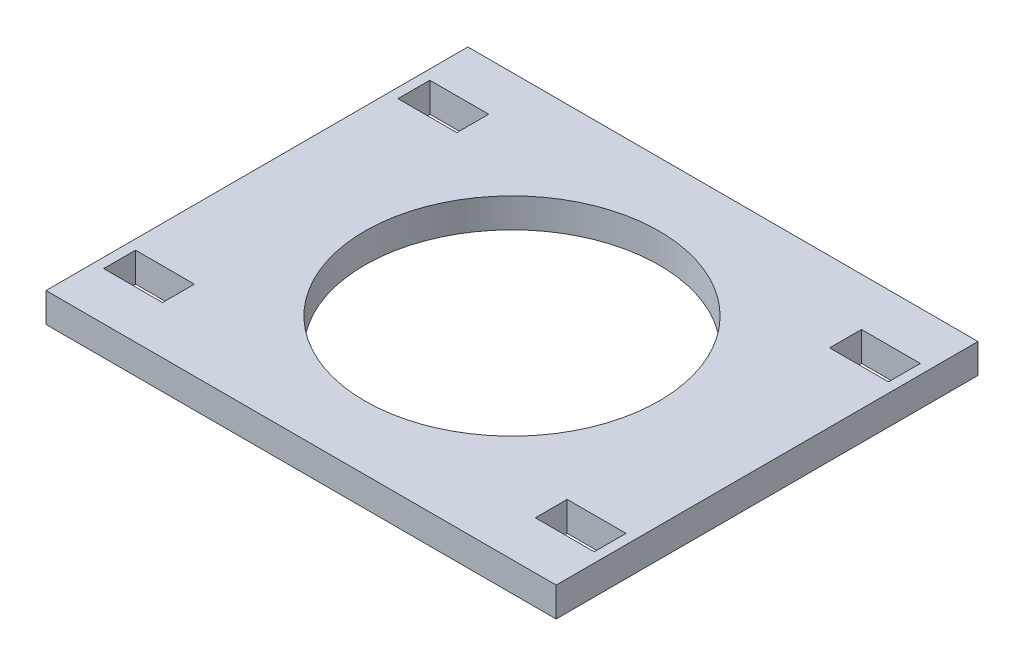
ISO-10303-21;
HEADER;
FILE_DESCRIPTION(('STEP AP214'),'2;1');
FILE_NAME('part.step','',(''),(''),'','','');
FILE_SCHEMA(('AUTOMOTIVE_DESIGN { 1 0 10303 214 1 1 1 1 }'));
ENDSEC;
DATA;
#1=APPLICATION_CONTEXT('core data for automotive mechanical design processes');
#2=APPLICATION_PROTOCOL_DEFINITION('international standard','automotive_design',2000,#1);
#3=PRODUCT_CONTEXT('',#1,'mechanical');
#4=PRODUCT('Part','Part','',(#3));
#5=PRODUCT_RELATED_PRODUCT_CATEGORY('part','',(#4));
#6=PRODUCT_DEFINITION_FORMATION('','',#4);
#7=PRODUCT_DEFINITION_CONTEXT('part definition',#1,'design');
#8=PRODUCT_DEFINITION('design','',#6,#7);
#9=PRODUCT_DEFINITION_SHAPE('','',#8);
#10=(LENGTH_UNIT() NAMED_UNIT(*) SI_UNIT(.MILLI.,.METRE.));
#11=(NAMED_UNIT(*) PLANE_ANGLE_UNIT() SI_UNIT($,.RADIAN.));
#12=(NAMED_UNIT(*) SI_UNIT($,.STERADIAN.) SOLID_ANGLE_UNIT());
#13=UNCERTAINTY_MEASURE_WITH_UNIT(LENGTH_MEASURE(1.E-05),#10,'distance_accuracy_value','');
#14=(GEOMETRIC_REPRESENTATION_CONTEXT(3) GLOBAL_UNCERTAINTY_ASSIGNED_CONTEXT((#13)) GLOBAL_UNIT_ASSIGNED_CONTEXT((#10,
#11,#12)) REPRESENTATION_CONTEXT('',''));
#15=CARTESIAN_POINT('',(0.,0.,0.));
#16=DIRECTION('',(0.,0.,1.));
#17=DIRECTION('',(1.,0.,0.));
#18=AXIS2_PLACEMENT_3D('',#15,#16,#17);
#19=CARTESIAN_POINT('',(0.,6.,0.));
#20=DIRECTION('',(0.,-1.,0.));
#21=DIRECTION('',(0.,0.,-1.));
#22=AXIS2_PLACEMENT_3D('',#19,#20,#21);
#23=PLANE('',#22);
#24=DIRECTION('',(0.,0.,1.));
#25=VECTOR('',#24,1.);
#26=CARTESIAN_POINT('',(38.,6.,33.25));
#27=LINE('',#26,#25);
#28=CARTESIAN_POINT('',(38.,6.,26.75));
#29=VERTEX_POINT('',#28);
#30=CARTESIAN_POINT('',(38.,6.,33.25));
#31=VERTEX_POINT('',#30);
#32=EDGE_CURVE('E214',#29,#31,#27,.T.);
#33=ORIENTED_EDGE('',*,*,#32,.F.);
#34=DIRECTION('',(-1.,0.,0.));
#35=VECTOR('',#34,1.);
#36=CARTESIAN_POINT('',(38.,6.,26.75));
#37=LINE('',#36,#35);
#38=CARTESIAN_POINT('',(50.,6.,26.75));
#39=VERTEX_POINT('',#38);
#40=EDGE_CURVE('E223',#39,#29,#37,.T.);
#41=ORIENTED_EDGE('',*,*,#40,.F.);
#42=DIRECTION('',(0.,0.,-1.));
#43=VECTOR('',#42,1.);
#44=CARTESIAN_POINT('',(50.,6.,33.25));
#45=LINE('',#44,#43);
#46=CARTESIAN_POINT('',(50.,6.,33.25));
#47=VERTEX_POINT('',#46);
#48=EDGE_CURVE('E217',#47,#39,#45,.T.);
#49=ORIENTED_EDGE('',*,*,#48,.F.);
#50=DIRECTION('',(1.,0.,0.));
#51=VECTOR('',#50,1.);
#52=CARTESIAN_POINT('',(38.,6.,33.25));
#53=LINE('',#52,#51);
#54=EDGE_CURVE('E220',#31,#47,#53,.T.);
#55=ORIENTED_EDGE('',*,*,#54,.F.);
#56=EDGE_LOOP('',(#33,#41,#49,#55));
#57=FACE_BOUND('',#56,.T.);
#58=DIRECTION('',(0.,0.,1.));
#59=VECTOR('',#58,1.);
#60=CARTESIAN_POINT('',(-50.,6.,33.25));
#61=LINE('',#60,#59);
#62=CARTESIAN_POINT('',(-50.,6.,26.75));
#63=VERTEX_POINT('',#62);
#64=CARTESIAN_POINT('',(-50.,6.,33.25));
#65=VERTEX_POINT('',#64);
#66=EDGE_CURVE('E280',#63,#65,#61,.T.);
#67=ORIENTED_EDGE('',*,*,#66,.F.);
#68=DIRECTION('',(-1.,0.,0.));
#69=VECTOR('',#68,1.);
#70=CARTESIAN_POINT('',(-50.,6.,26.75));
#71=LINE('',#70,#69);
#72=CARTESIAN_POINT('',(-38.,6.,26.75));
#73=VERTEX_POINT('',#72);
#74=EDGE_CURVE('E283',#73,#63,#71,.T.);
#75=ORIENTED_EDGE('',*,*,#74,.F.);
#76=DIRECTION('',(0.,0.,-1.));
#77=VECTOR('',#76,1.);
#78=CARTESIAN_POINT('',(-38.,6.,33.25));
#79=LINE('',#78,#77);
#80=CARTESIAN_POINT('',(-38.,6.,33.25));
#81=VERTEX_POINT('',#80);
#82=EDGE_CURVE('E285',#81,#73,#79,.T.);
#83=ORIENTED_EDGE('',*,*,#82,.F.);
#84=DIRECTION('',(1.,0.,0.));
#85=VECTOR('',#84,1.);
#86=CARTESIAN_POINT('',(-50.,6.,33.25));
#87=LINE('',#86,#85);
#88=EDGE_CURVE('E278',#65,#81,#87,.T.);
#89=ORIENTED_EDGE('',*,*,#88,.F.);
#90=EDGE_LOOP('',(#67,#75,#83,#89));
#91=FACE_BOUND('',#90,.T.);
#92=DIRECTION('',(0.,0.,1.));
#93=VECTOR('',#92,1.);
#94=CARTESIAN_POINT('',(-52.,6.,43.));
#95=LINE('',#94,#93);
#96=CARTESIAN_POINT('',(-52.,6.,-43.));
#97=VERTEX_POINT('',#96);
#98=CARTESIAN_POINT('',(-52.,6.,43.));
#99=VERTEX_POINT('',#98);
#100=EDGE_CURVE('E306',#97,#99,#95,.T.);
#101=ORIENTED_EDGE('',*,*,#100,.T.);
#102=DIRECTION('',(1.,0.,0.));
#103=VECTOR('',#102,1.);
#104=CARTESIAN_POINT('',(-52.,6.,43.));
#105=LINE('',#104,#103);
#106=CARTESIAN_POINT('',(52.,6.,43.));
#107=VERTEX_POINT('',#106);
#108=EDGE_CURVE('E311',#99,#107,#105,.T.);
#109=ORIENTED_EDGE('',*,*,#108,.T.);
#110=DIRECTION('',(0.,0.,-1.));
#111=VECTOR('',#110,1.);
#112=CARTESIAN_POINT('',(52.,6.,43.));
#113=LINE('',#112,#111);
#114=CARTESIAN_POINT('',(52.,6.,-43.));
#115=VERTEX_POINT('',#114);
#116=EDGE_CURVE('E312',#107,#115,#113,.T.);
#117=ORIENTED_EDGE('',*,*,#116,.T.);
#118=DIRECTION('',(-1.,0.,0.));
#119=VECTOR('',#118,1.);
#120=CARTESIAN_POINT('',(-52.,6.,-43.));
#121=LINE('',#120,#119);
#122=EDGE_CURVE('E316',#115,#97,#121,.T.);
#123=ORIENTED_EDGE('',*,*,#122,.T.);
#124=EDGE_LOOP('',(#101,#109,#117,#123));
#125=FACE_BOUND('',#124,.T.);
#126=DIRECTION('',(0.,0.,1.));
#127=VECTOR('',#126,1.);
#128=CARTESIAN_POINT('',(-50.,6.,-26.75));
#129=LINE('',#128,#127);
#130=CARTESIAN_POINT('',(-50.,6.,-33.25));
#131=VERTEX_POINT('',#130);
#132=CARTESIAN_POINT('',(-50.,6.,-26.75));
#133=VERTEX_POINT('',#132);
#134=EDGE_CURVE('E247',#131,#133,#129,.T.);
#135=ORIENTED_EDGE('',*,*,#134,.F.);
#136=DIRECTION('',(-1.,0.,0.));
#137=VECTOR('',#136,1.);
#138=CARTESIAN_POINT('',(-50.,6.,-33.25));
#139=LINE('',#138,#137);
#140=CARTESIAN_POINT('',(-38.,6.,-33.25));
#141=VERTEX_POINT('',#140);
#142=EDGE_CURVE('E253',#141,#131,#139,.T.);
#143=ORIENTED_EDGE('',*,*,#142,.F.);
#144=DIRECTION('',(0.,0.,-1.));
#145=VECTOR('',#144,1.);
#146=CARTESIAN_POINT('',(-38.,6.,-26.75));
#147=LINE('',#146,#145);
#148=CARTESIAN_POINT('',(-38.,6.,-26.75));
#149=VERTEX_POINT('',#148);
#150=EDGE_CURVE('E251',#149,#141,#147,.T.);
#151=ORIENTED_EDGE('',*,*,#150,.F.);
#152=DIRECTION('',(1.,0.,0.));
#153=VECTOR('',#152,1.);
#154=CARTESIAN_POINT('',(-50.,6.,-26.75));
#155=LINE('',#154,#153);
#156=EDGE_CURVE('E246',#133,#149,#155,.T.);
#157=ORIENTED_EDGE('',*,*,#156,.F.);
#158=EDGE_LOOP('',(#135,#143,#151,#157));
#159=FACE_BOUND('',#158,.T.);
#160=DIRECTION('',(0.,0.,1.));
#161=VECTOR('',#160,1.);
#162=CARTESIAN_POINT('',(38.,6.,-26.75));
#163=LINE('',#162,#161);
#164=CARTESIAN_POINT('',(38.,6.,-33.25));
#165=VERTEX_POINT('',#164);
#166=CARTESIAN_POINT('',(38.,6.,-26.75));
#167=VERTEX_POINT('',#166);
#168=EDGE_CURVE('E176',#165,#167,#163,.T.);
#169=ORIENTED_EDGE('',*,*,#168,.F.);
#170=DIRECTION('',(-1.,0.,0.));
#171=VECTOR('',#170,1.);
#172=CARTESIAN_POINT('',(38.,6.,-33.25));
#173=LINE('',#172,#171);
#174=CARTESIAN_POINT('',(50.,6.,-33.25));
#175=VERTEX_POINT('',#174);
#176=EDGE_CURVE('E198',#175,#165,#173,.T.);
#177=ORIENTED_EDGE('',*,*,#176,.F.);
#178=DIRECTION('',(0.,0.,-1.));
#179=VECTOR('',#178,1.);
#180=CARTESIAN_POINT('',(50.,6.,-26.75));
#181=LINE('',#180,#179);
#182=CARTESIAN_POINT('',(50.,6.,-26.75));
#183=VERTEX_POINT('',#182);
#184=EDGE_CURVE('E197',#183,#175,#181,.T.);
#185=ORIENTED_EDGE('',*,*,#184,.F.);
#186=DIRECTION('',(1.,0.,0.));
#187=VECTOR('',#186,1.);
#188=CARTESIAN_POINT('',(38.,6.,-26.75));
#189=LINE('',#188,#187);
#190=EDGE_CURVE('E182',#167,#183,#189,.T.);
#191=ORIENTED_EDGE('',*,*,#190,.F.);
#192=EDGE_LOOP('',(#169,#177,#185,#191));
#193=FACE_BOUND('',#192,.T.);
#194=CARTESIAN_POINT('',(0.,6.,0.));
#195=DIRECTION('',(0.,1.,0.));
#196=DIRECTION('',(0.,0.,1.));
#197=AXIS2_PLACEMENT_3D('',#194,#195,#196);
#198=CIRCLE('',#197,30.);
#199=CARTESIAN_POINT('',(0.,6.,30.));
#200=VERTEX_POINT('',#199);
#201=EDGE_CURVE('E203',#200,#200,#198,.T.);
#202=ORIENTED_EDGE('',*,*,#201,.F.);
#203=EDGE_LOOP('',(#202));
#204=FACE_BOUND('',#203,.T.);
#205=ADVANCED_FACE('F39',(#57,#91,#125,#159,#193,#204),#23,.F.);
#206=CARTESIAN_POINT('',(0.,0.,0.));
#207=DIRECTION('',(0.,-1.,0.));
#208=DIRECTION('',(0.,0.,-1.));
#209=AXIS2_PLACEMENT_3D('',#206,#207,#208);
#210=PLANE('',#209);
#211=DIRECTION('',(-1.,0.,0.));
#212=VECTOR('',#211,1.);
#213=CARTESIAN_POINT('',(38.,0.,-33.25));
#214=LINE('',#213,#212);
#215=CARTESIAN_POINT('',(50.,0.,-33.25));
#216=VERTEX_POINT('',#215);
#217=CARTESIAN_POINT('',(38.,0.,-33.25));
#218=VERTEX_POINT('',#217);
#219=EDGE_CURVE('E184',#216,#218,#214,.T.);
#220=ORIENTED_EDGE('',*,*,#219,.T.);
#221=DIRECTION('',(0.,0.,1.));
#222=VECTOR('',#221,1.);
#223=CARTESIAN_POINT('',(38.,0.,-26.75));
#224=LINE('',#223,#222);
#225=CARTESIAN_POINT('',(38.,0.,-26.75));
#226=VERTEX_POINT('',#225);
#227=EDGE_CURVE('E62',#218,#226,#224,.T.);
#228=ORIENTED_EDGE('',*,*,#227,.T.);
#229=DIRECTION('',(1.,0.,0.));
#230=VECTOR('',#229,1.);
#231=CARTESIAN_POINT('',(38.,0.,-26.75));
#232=LINE('',#231,#230);
#233=CARTESIAN_POINT('',(50.,0.,-26.75));
#234=VERTEX_POINT('',#233);
#235=EDGE_CURVE('E192',#226,#234,#232,.T.);
#236=ORIENTED_EDGE('',*,*,#235,.T.);
#237=DIRECTION('',(0.,0.,-1.));
#238=VECTOR('',#237,1.);
#239=CARTESIAN_POINT('',(50.,0.,-26.75));
#240=LINE('',#239,#238);
#241=EDGE_CURVE('E207',#234,#216,#240,.T.);
#242=ORIENTED_EDGE('',*,*,#241,.T.);
#243=EDGE_LOOP('',(#220,#228,#236,#242));
#244=FACE_BOUND('',#243,.T.);
#245=DIRECTION('',(-1.,0.,0.));
#246=VECTOR('',#245,1.);
#247=CARTESIAN_POINT('',(38.,0.,26.75));
#248=LINE('',#247,#246);
#249=CARTESIAN_POINT('',(50.,0.,26.75));
#250=VERTEX_POINT('',#249);
#251=CARTESIAN_POINT('',(38.,0.,26.75));
#252=VERTEX_POINT('',#251);
#253=EDGE_CURVE('E216',#250,#252,#248,.T.);
#254=ORIENTED_EDGE('',*,*,#253,.T.);
#255=DIRECTION('',(0.,0.,1.));
#256=VECTOR('',#255,1.);
#257=CARTESIAN_POINT('',(38.,0.,33.25));
#258=LINE('',#257,#256);
#259=CARTESIAN_POINT('',(38.,0.,33.25));
#260=VERTEX_POINT('',#259);
#261=EDGE_CURVE('E195',#252,#260,#258,.T.);
#262=ORIENTED_EDGE('',*,*,#261,.T.);
#263=DIRECTION('',(1.,0.,0.));
#264=VECTOR('',#263,1.);
#265=CARTESIAN_POINT('',(38.,0.,33.25));
#266=LINE('',#265,#264);
#267=CARTESIAN_POINT('',(50.,0.,33.25));
#268=VERTEX_POINT('',#267);
#269=EDGE_CURVE('E228',#260,#268,#266,.T.);
#270=ORIENTED_EDGE('',*,*,#269,.T.);
#271=DIRECTION('',(0.,0.,-1.));
#272=VECTOR('',#271,1.);
#273=CARTESIAN_POINT('',(50.,0.,33.25));
#274=LINE('',#273,#272);
#275=EDGE_CURVE('E231',#268,#250,#274,.T.);
#276=ORIENTED_EDGE('',*,*,#275,.T.);
#277=EDGE_LOOP('',(#254,#262,#270,#276));
#278=FACE_BOUND('',#277,.T.);
#279=DIRECTION('',(-1.,0.,0.));
#280=VECTOR('',#279,1.);
#281=CARTESIAN_POINT('',(-50.,0.,-33.25));
#282=LINE('',#281,#280);
#283=CARTESIAN_POINT('',(-38.,0.,-33.25));
#284=VERTEX_POINT('',#283);
#285=CARTESIAN_POINT('',(-50.,0.,-33.25));
#286=VERTEX_POINT('',#285);
#287=EDGE_CURVE('E249',#284,#286,#282,.T.);
#288=ORIENTED_EDGE('',*,*,#287,.T.);
#289=DIRECTION('',(0.,0.,1.));
#290=VECTOR('',#289,1.);
#291=CARTESIAN_POINT('',(-50.,0.,-26.75));
#292=LINE('',#291,#290);
#293=CARTESIAN_POINT('',(-50.,0.,-26.75));
#294=VERTEX_POINT('',#293);
#295=EDGE_CURVE('E245',#286,#294,#292,.T.);
#296=ORIENTED_EDGE('',*,*,#295,.T.);
#297=DIRECTION('',(1.,0.,0.));
#298=VECTOR('',#297,1.);
#299=CARTESIAN_POINT('',(-50.,0.,-26.75));
#300=LINE('',#299,#298);
#301=CARTESIAN_POINT('',(-38.,0.,-26.75));
#302=VERTEX_POINT('',#301);
#303=EDGE_CURVE('E260',#294,#302,#300,.T.);
#304=ORIENTED_EDGE('',*,*,#303,.T.);
#305=DIRECTION('',(0.,0.,-1.));
#306=VECTOR('',#305,1.);
#307=CARTESIAN_POINT('',(-38.,0.,-26.75));
#308=LINE('',#307,#306);
#309=EDGE_CURVE('E265',#302,#284,#308,.T.);
#310=ORIENTED_EDGE('',*,*,#309,.T.);
#311=EDGE_LOOP('',(#288,#296,#304,#310));
#312=FACE_BOUND('',#311,.T.);
#313=DIRECTION('',(-1.,0.,0.));
#314=VECTOR('',#313,1.);
#315=CARTESIAN_POINT('',(-50.,0.,26.75));
#316=LINE('',#315,#314);
#317=CARTESIAN_POINT('',(-38.,0.,26.75));
#318=VERTEX_POINT('',#317);
#319=CARTESIAN_POINT('',(-50.,0.,26.75));
#320=VERTEX_POINT('',#319);
#321=EDGE_CURVE('E279',#318,#320,#316,.T.);
#322=ORIENTED_EDGE('',*,*,#321,.T.);
#323=DIRECTION('',(0.,0.,1.));
#324=VECTOR('',#323,1.);
#325=CARTESIAN_POINT('',(-50.,0.,33.25));
#326=LINE('',#325,#324);
#327=CARTESIAN_POINT('',(-50.,0.,33.25));
#328=VERTEX_POINT('',#327);
#329=EDGE_CURVE('E276',#320,#328,#326,.T.);
#330=ORIENTED_EDGE('',*,*,#329,.T.);
#331=DIRECTION('',(1.,0.,0.));
#332=VECTOR('',#331,1.);
#333=CARTESIAN_POINT('',(-50.,0.,33.25));
#334=LINE('',#333,#332);
#335=CARTESIAN_POINT('',(-38.,0.,33.25));
#336=VERTEX_POINT('',#335);
#337=EDGE_CURVE('E290',#328,#336,#334,.T.);
#338=ORIENTED_EDGE('',*,*,#337,.T.);
#339=DIRECTION('',(0.,0.,-1.));
#340=VECTOR('',#339,1.);
#341=CARTESIAN_POINT('',(-38.,0.,33.25));
#342=LINE('',#341,#340);
#343=EDGE_CURVE('E291',#336,#318,#342,.T.);
#344=ORIENTED_EDGE('',*,*,#343,.T.);
#345=EDGE_LOOP('',(#322,#330,#338,#344));
#346=FACE_BOUND('',#345,.T.);
#347=DIRECTION('',(0.,0.,1.));
#348=VECTOR('',#347,1.);
#349=CARTESIAN_POINT('',(-52.,0.,43.));
#350=LINE('',#349,#348);
#351=CARTESIAN_POINT('',(-52.,0.,-43.));
#352=VERTEX_POINT('',#351);
#353=CARTESIAN_POINT('',(-52.,0.,43.));
#354=VERTEX_POINT('',#353);
#355=EDGE_CURVE('E310',#352,#354,#350,.T.);
#356=ORIENTED_EDGE('',*,*,#355,.F.);
#357=DIRECTION('',(-1.,0.,0.));
#358=VECTOR('',#357,1.);
#359=CARTESIAN_POINT('',(-52.,0.,-43.));
#360=LINE('',#359,#358);
#361=CARTESIAN_POINT('',(52.,0.,-43.));
#362=VERTEX_POINT('',#361);
#363=EDGE_CURVE('E315',#362,#352,#360,.T.);
#364=ORIENTED_EDGE('',*,*,#363,.F.);
#365=DIRECTION('',(0.,0.,-1.));
#366=VECTOR('',#365,1.);
#367=CARTESIAN_POINT('',(52.,0.,43.));
#368=LINE('',#367,#366);
#369=CARTESIAN_POINT('',(52.,0.,43.));
#370=VERTEX_POINT('',#369);
#371=EDGE_CURVE('E322',#370,#362,#368,.T.);
#372=ORIENTED_EDGE('',*,*,#371,.F.);
#373=DIRECTION('',(1.,0.,0.));
#374=VECTOR('',#373,1.);
#375=CARTESIAN_POINT('',(-52.,0.,43.));
#376=LINE('',#375,#374);
#377=EDGE_CURVE('E321',#354,#370,#376,.T.);
#378=ORIENTED_EDGE('',*,*,#377,.F.);
#379=EDGE_LOOP('',(#356,#364,#372,#378));
#380=FACE_BOUND('',#379,.T.);
#381=CARTESIAN_POINT('',(0.,0.,0.));
#382=DIRECTION('',(0.,1.,0.));
#383=DIRECTION('',(0.,0.,1.));
#384=AXIS2_PLACEMENT_3D('',#381,#382,#383);
#385=CIRCLE('',#384,30.);
#386=CARTESIAN_POINT('',(0.,0.,30.));
#387=VERTEX_POINT('',#386);
#388=EDGE_CURVE('E460',#387,#387,#385,.T.);
#389=ORIENTED_EDGE('',*,*,#388,.T.);
#390=EDGE_LOOP('',(#389));
#391=FACE_BOUND('',#390,.T.);
#392=ADVANCED_FACE('F341',(#244,#278,#312,#346,#380,#391),#210,.T.);
#393=CARTESIAN_POINT('',(-52.,6.,43.));
#394=DIRECTION('',(1.,0.,0.));
#395=DIRECTION('',(0.,0.,-1.));
#396=AXIS2_PLACEMENT_3D('',#393,#394,#395);
#397=PLANE('',#396);
#398=ORIENTED_EDGE('',*,*,#355,.T.);
#399=DIRECTION('',(0.,-1.,0.));
#400=VECTOR('',#399,1.);
#401=CARTESIAN_POINT('',(-52.,6.,43.));
#402=LINE('',#401,#400);
#403=EDGE_CURVE('E11',#99,#354,#402,.T.);
#404=ORIENTED_EDGE('',*,*,#403,.F.);
#405=ORIENTED_EDGE('',*,*,#100,.F.);
#406=DIRECTION('',(0.,-1.,0.));
#407=VECTOR('',#406,1.);
#408=CARTESIAN_POINT('',(-52.,6.,-43.));
#409=LINE('',#408,#407);
#410=EDGE_CURVE('E318',#97,#352,#409,.T.);
#411=ORIENTED_EDGE('',*,*,#410,.T.);
#412=EDGE_LOOP('',(#398,#404,#405,#411));
#413=FACE_BOUND('',#412,.T.);
#414=ADVANCED_FACE('F41',(#413),#397,.F.);
#415=CARTESIAN_POINT('',(-52.,6.,43.));
#416=DIRECTION('',(0.,0.,-1.));
#417=DIRECTION('',(-1.,0.,0.));
#418=AXIS2_PLACEMENT_3D('',#415,#416,#417);
#419=PLANE('',#418);
#420=ORIENTED_EDGE('',*,*,#377,.T.);
#421=DIRECTION('',(0.,-1.,0.));
#422=VECTOR('',#421,1.);
#423=CARTESIAN_POINT('',(52.,6.,43.));
#424=LINE('',#423,#422);
#425=EDGE_CURVE('E50',#107,#370,#424,.T.);
#426=ORIENTED_EDGE('',*,*,#425,.F.);
#427=ORIENTED_EDGE('',*,*,#108,.F.);
#428=ORIENTED_EDGE('',*,*,#403,.T.);
#429=EDGE_LOOP('',(#420,#426,#427,#428));
#430=FACE_BOUND('',#429,.T.);
#431=ADVANCED_FACE('F355',(#430),#419,.F.);
#432=CARTESIAN_POINT('',(52.,6.,43.));
#433=DIRECTION('',(-1.,0.,0.));
#434=DIRECTION('',(0.,0.,1.));
#435=AXIS2_PLACEMENT_3D('',#432,#433,#434);
#436=PLANE('',#435);
#437=ORIENTED_EDGE('',*,*,#371,.T.);
#438=DIRECTION('',(0.,-1.,0.));
#439=VECTOR('',#438,1.);
#440=CARTESIAN_POINT('',(52.,6.,-43.));
#441=LINE('',#440,#439);
#442=EDGE_CURVE('E329',#115,#362,#441,.T.);
#443=ORIENTED_EDGE('',*,*,#442,.F.);
#444=ORIENTED_EDGE('',*,*,#116,.F.);
#445=ORIENTED_EDGE('',*,*,#425,.T.);
#446=EDGE_LOOP('',(#437,#443,#444,#445));
#447=FACE_BOUND('',#446,.T.);
#448=ADVANCED_FACE('F335',(#447),#436,.F.);
#449=CARTESIAN_POINT('',(-52.,6.,-43.));
#450=DIRECTION('',(0.,0.,1.));
#451=DIRECTION('',(1.,0.,0.));
#452=AXIS2_PLACEMENT_3D('',#449,#450,#451);
#453=PLANE('',#452);
#454=ORIENTED_EDGE('',*,*,#363,.T.);
#455=ORIENTED_EDGE('',*,*,#410,.F.);
#456=ORIENTED_EDGE('',*,*,#122,.F.);
#457=ORIENTED_EDGE('',*,*,#442,.T.);
#458=EDGE_LOOP('',(#454,#455,#456,#457));
#459=FACE_BOUND('',#458,.T.);
#460=ADVANCED_FACE('F345',(#459),#453,.F.);
#461=CARTESIAN_POINT('',(-50.,6.,33.25));
#462=DIRECTION('',(1.,0.,0.));
#463=DIRECTION('',(0.,0.,-1.));
#464=AXIS2_PLACEMENT_3D('',#461,#462,#463);
#465=PLANE('',#464);
#466=ORIENTED_EDGE('',*,*,#329,.F.);
#467=DIRECTION('',(0.,-1.,0.));
#468=VECTOR('',#467,1.);
#469=CARTESIAN_POINT('',(-50.,6.,26.75));
#470=LINE('',#469,#468);
#471=EDGE_CURVE('E287',#63,#320,#470,.T.);
#472=ORIENTED_EDGE('',*,*,#471,.F.);
#473=ORIENTED_EDGE('',*,*,#66,.T.);
#474=DIRECTION('',(0.,-1.,0.));
#475=VECTOR('',#474,1.);
#476=CARTESIAN_POINT('',(-50.,6.,33.25));
#477=LINE('',#476,#475);
#478=EDGE_CURVE('E305',#65,#328,#477,.T.);
#479=ORIENTED_EDGE('',*,*,#478,.T.);
#480=EDGE_LOOP('',(#466,#472,#473,#479));
#481=FACE_BOUND('',#480,.T.);
#482=ADVANCED_FACE('F369',(#481),#465,.T.);
#483=CARTESIAN_POINT('',(-50.,6.,33.25));
#484=DIRECTION('',(0.,0.,-1.));
#485=DIRECTION('',(-1.,0.,0.));
#486=AXIS2_PLACEMENT_3D('',#483,#484,#485);
#487=PLANE('',#486);
#488=ORIENTED_EDGE('',*,*,#337,.F.);
#489=ORIENTED_EDGE('',*,*,#478,.F.);
#490=ORIENTED_EDGE('',*,*,#88,.T.);
#491=DIRECTION('',(0.,-1.,0.));
#492=VECTOR('',#491,1.);
#493=CARTESIAN_POINT('',(-38.,6.,33.25));
#494=LINE('',#493,#492);
#495=EDGE_CURVE('E302',#81,#336,#494,.T.);
#496=ORIENTED_EDGE('',*,*,#495,.T.);
#497=EDGE_LOOP('',(#488,#489,#490,#496));
#498=FACE_BOUND('',#497,.T.);
#499=ADVANCED_FACE('F377',(#498),#487,.T.);
#500=CARTESIAN_POINT('',(-38.,6.,33.25));
#501=DIRECTION('',(-1.,0.,0.));
#502=DIRECTION('',(0.,0.,1.));
#503=AXIS2_PLACEMENT_3D('',#500,#501,#502);
#504=PLANE('',#503);
#505=ORIENTED_EDGE('',*,*,#343,.F.);
#506=ORIENTED_EDGE('',*,*,#495,.F.);
#507=ORIENTED_EDGE('',*,*,#82,.T.);
#508=DIRECTION('',(0.,-1.,0.));
#509=VECTOR('',#508,1.);
#510=CARTESIAN_POINT('',(-38.,6.,26.75));
#511=LINE('',#510,#509);
#512=EDGE_CURVE('E300',#73,#318,#511,.T.);
#513=ORIENTED_EDGE('',*,*,#512,.T.);
#514=EDGE_LOOP('',(#505,#506,#507,#513));
#515=FACE_BOUND('',#514,.T.);
#516=ADVANCED_FACE('F385',(#515),#504,.T.);
#517=CARTESIAN_POINT('',(-50.,6.,26.75));
#518=DIRECTION('',(0.,0.,1.));
#519=DIRECTION('',(1.,0.,0.));
#520=AXIS2_PLACEMENT_3D('',#517,#518,#519);
#521=PLANE('',#520);
#522=ORIENTED_EDGE('',*,*,#321,.F.);
#523=ORIENTED_EDGE('',*,*,#512,.F.);
#524=ORIENTED_EDGE('',*,*,#74,.T.);
#525=ORIENTED_EDGE('',*,*,#471,.T.);
#526=EDGE_LOOP('',(#522,#523,#524,#525));
#527=FACE_BOUND('',#526,.T.);
#528=ADVANCED_FACE('F390',(#527),#521,.T.);
#529=CARTESIAN_POINT('',(-50.,6.,-26.75));
#530=DIRECTION('',(1.,0.,0.));
#531=DIRECTION('',(0.,0.,-1.));
#532=AXIS2_PLACEMENT_3D('',#529,#530,#531);
#533=PLANE('',#532);
#534=ORIENTED_EDGE('',*,*,#295,.F.);
#535=DIRECTION('',(0.,-1.,0.));
#536=VECTOR('',#535,1.);
#537=CARTESIAN_POINT('',(-50.,6.,-33.25));
#538=LINE('',#537,#536);
#539=EDGE_CURVE('E258',#131,#286,#538,.T.);
#540=ORIENTED_EDGE('',*,*,#539,.F.);
#541=ORIENTED_EDGE('',*,*,#134,.T.);
#542=DIRECTION('',(0.,-1.,0.));
#543=VECTOR('',#542,1.);
#544=CARTESIAN_POINT('',(-50.,6.,-26.75));
#545=LINE('',#544,#543);
#546=EDGE_CURVE('E273',#133,#294,#545,.T.);
#547=ORIENTED_EDGE('',*,*,#546,.T.);
#548=EDGE_LOOP('',(#534,#540,#541,#547));
#549=FACE_BOUND('',#548,.T.);
#550=ADVANCED_FACE('F405',(#549),#533,.T.);
#551=CARTESIAN_POINT('',(-50.,6.,-26.75));
#552=DIRECTION('',(0.,0.,-1.));
#553=DIRECTION('',(-1.,0.,0.));
#554=AXIS2_PLACEMENT_3D('',#551,#552,#553);
#555=PLANE('',#554);
#556=ORIENTED_EDGE('',*,*,#303,.F.);
#557=ORIENTED_EDGE('',*,*,#546,.F.);
#558=ORIENTED_EDGE('',*,*,#156,.T.);
#559=DIRECTION('',(0.,-1.,0.));
#560=VECTOR('',#559,1.);
#561=CARTESIAN_POINT('',(-38.,6.,-26.75));
#562=LINE('',#561,#560);
#563=EDGE_CURVE('E271',#149,#302,#562,.T.);
#564=ORIENTED_EDGE('',*,*,#563,.T.);
#565=EDGE_LOOP('',(#556,#557,#558,#564));
#566=FACE_BOUND('',#565,.T.);
#567=ADVANCED_FACE('F410',(#566),#555,.T.);
#568=CARTESIAN_POINT('',(-38.,6.,-26.75));
#569=DIRECTION('',(-1.,0.,0.));
#570=DIRECTION('',(0.,0.,1.));
#571=AXIS2_PLACEMENT_3D('',#568,#569,#570);
#572=PLANE('',#571);
#573=ORIENTED_EDGE('',*,*,#309,.F.);
#574=ORIENTED_EDGE('',*,*,#563,.F.);
#575=ORIENTED_EDGE('',*,*,#150,.T.);
#576=DIRECTION('',(0.,-1.,0.));
#577=VECTOR('',#576,1.);
#578=CARTESIAN_POINT('',(-38.,6.,-33.25));
#579=LINE('',#578,#577);
#580=EDGE_CURVE('E267',#141,#284,#579,.T.);
#581=ORIENTED_EDGE('',*,*,#580,.T.);
#582=EDGE_LOOP('',(#573,#574,#575,#581));
#583=FACE_BOUND('',#582,.T.);
#584=ADVANCED_FACE('F411',(#583),#572,.T.);
#585=CARTESIAN_POINT('',(-50.,6.,-33.25));
#586=DIRECTION('',(0.,0.,1.));
#587=DIRECTION('',(1.,0.,0.));
#588=AXIS2_PLACEMENT_3D('',#585,#586,#587);
#589=PLANE('',#588);
#590=ORIENTED_EDGE('',*,*,#287,.F.);
#591=ORIENTED_EDGE('',*,*,#580,.F.);
#592=ORIENTED_EDGE('',*,*,#142,.T.);
#593=ORIENTED_EDGE('',*,*,#539,.T.);
#594=EDGE_LOOP('',(#590,#591,#592,#593));
#595=FACE_BOUND('',#594,.T.);
#596=ADVANCED_FACE('F414',(#595),#589,.T.);
#597=CARTESIAN_POINT('',(38.,6.,33.25));
#598=DIRECTION('',(1.,0.,0.));
#599=DIRECTION('',(0.,0.,-1.));
#600=AXIS2_PLACEMENT_3D('',#597,#598,#599);
#601=PLANE('',#600);
#602=ORIENTED_EDGE('',*,*,#261,.F.);
#603=DIRECTION('',(0.,-1.,0.));
#604=VECTOR('',#603,1.);
#605=CARTESIAN_POINT('',(38.,6.,26.75));
#606=LINE('',#605,#604);
#607=EDGE_CURVE('E224',#29,#252,#606,.T.);
#608=ORIENTED_EDGE('',*,*,#607,.F.);
#609=ORIENTED_EDGE('',*,*,#32,.T.);
#610=DIRECTION('',(0.,-1.,0.));
#611=VECTOR('',#610,1.);
#612=CARTESIAN_POINT('',(38.,6.,33.25));
#613=LINE('',#612,#611);
#614=EDGE_CURVE('E242',#31,#260,#613,.T.);
#615=ORIENTED_EDGE('',*,*,#614,.T.);
#616=EDGE_LOOP('',(#602,#608,#609,#615));
#617=FACE_BOUND('',#616,.T.);
#618=ADVANCED_FACE('F416',(#617),#601,.T.);
#619=CARTESIAN_POINT('',(38.,6.,33.25));
#620=DIRECTION('',(0.,0.,-1.));
#621=DIRECTION('',(-1.,0.,0.));
#622=AXIS2_PLACEMENT_3D('',#619,#620,#621);
#623=PLANE('',#622);
#624=ORIENTED_EDGE('',*,*,#269,.F.);
#625=ORIENTED_EDGE('',*,*,#614,.F.);
#626=ORIENTED_EDGE('',*,*,#54,.T.);
#627=DIRECTION('',(0.,-1.,0.));
#628=VECTOR('',#627,1.);
#629=CARTESIAN_POINT('',(50.,6.,33.25));
#630=LINE('',#629,#628);
#631=EDGE_CURVE('E238',#47,#268,#630,.T.);
#632=ORIENTED_EDGE('',*,*,#631,.T.);
#633=EDGE_LOOP('',(#624,#625,#626,#632));
#634=FACE_BOUND('',#633,.T.);
#635=ADVANCED_FACE('F424',(#634),#623,.T.);
#636=CARTESIAN_POINT('',(50.,6.,33.25));
#637=DIRECTION('',(-1.,0.,0.));
#638=DIRECTION('',(0.,0.,1.));
#639=AXIS2_PLACEMENT_3D('',#636,#637,#638);
#640=PLANE('',#639);
#641=ORIENTED_EDGE('',*,*,#275,.F.);
#642=ORIENTED_EDGE('',*,*,#631,.F.);
#643=ORIENTED_EDGE('',*,*,#48,.T.);
#644=DIRECTION('',(0.,-1.,0.));
#645=VECTOR('',#644,1.);
#646=CARTESIAN_POINT('',(50.,6.,26.75));
#647=LINE('',#646,#645);
#648=EDGE_CURVE('E239',#39,#250,#647,.T.);
#649=ORIENTED_EDGE('',*,*,#648,.T.);
#650=EDGE_LOOP('',(#641,#642,#643,#649));
#651=FACE_BOUND('',#650,.T.);
#652=ADVANCED_FACE('F430',(#651),#640,.T.);
#653=CARTESIAN_POINT('',(38.,6.,26.75));
#654=DIRECTION('',(0.,0.,1.));
#655=DIRECTION('',(1.,0.,0.));
#656=AXIS2_PLACEMENT_3D('',#653,#654,#655);
#657=PLANE('',#656);
#658=ORIENTED_EDGE('',*,*,#253,.F.);
#659=ORIENTED_EDGE('',*,*,#648,.F.);
#660=ORIENTED_EDGE('',*,*,#40,.T.);
#661=ORIENTED_EDGE('',*,*,#607,.T.);
#662=EDGE_LOOP('',(#658,#659,#660,#661));
#663=FACE_BOUND('',#662,.T.);
#664=ADVANCED_FACE('F431',(#663),#657,.T.);
#665=CARTESIAN_POINT('',(38.,6.,-26.75));
#666=DIRECTION('',(1.,0.,0.));
#667=DIRECTION('',(0.,0.,-1.));
#668=AXIS2_PLACEMENT_3D('',#665,#666,#667);
#669=PLANE('',#668);
#670=ORIENTED_EDGE('',*,*,#227,.F.);
#671=DIRECTION('',(0.,-1.,0.));
#672=VECTOR('',#671,1.);
#673=CARTESIAN_POINT('',(38.,6.,-33.25));
#674=LINE('',#673,#672);
#675=EDGE_CURVE('E179',#165,#218,#674,.T.);
#676=ORIENTED_EDGE('',*,*,#675,.F.);
#677=ORIENTED_EDGE('',*,*,#168,.T.);
#678=DIRECTION('',(0.,-1.,0.));
#679=VECTOR('',#678,1.);
#680=CARTESIAN_POINT('',(38.,6.,-26.75));
#681=LINE('',#680,#679);
#682=EDGE_CURVE('E177',#167,#226,#681,.T.);
#683=ORIENTED_EDGE('',*,*,#682,.T.);
#684=EDGE_LOOP('',(#670,#676,#677,#683));
#685=FACE_BOUND('',#684,.T.);
#686=ADVANCED_FACE('F178',(#685),#669,.T.);
#687=CARTESIAN_POINT('',(38.,6.,-26.75));
#688=DIRECTION('',(0.,0.,-1.));
#689=DIRECTION('',(-1.,0.,0.));
#690=AXIS2_PLACEMENT_3D('',#687,#688,#689);
#691=PLANE('',#690);
#692=ORIENTED_EDGE('',*,*,#235,.F.);
#693=ORIENTED_EDGE('',*,*,#682,.F.);
#694=ORIENTED_EDGE('',*,*,#190,.T.);
#695=DIRECTION('',(0.,-1.,0.));
#696=VECTOR('',#695,1.);
#697=CARTESIAN_POINT('',(50.,6.,-26.75));
#698=LINE('',#697,#696);
#699=EDGE_CURVE('E194',#183,#234,#698,.T.);
#700=ORIENTED_EDGE('',*,*,#699,.T.);
#701=EDGE_LOOP('',(#692,#693,#694,#700));
#702=FACE_BOUND('',#701,.T.);
#703=ADVANCED_FACE('F187',(#702),#691,.T.);
#704=CARTESIAN_POINT('',(50.,6.,-26.75));
#705=DIRECTION('',(-1.,0.,0.));
#706=DIRECTION('',(0.,0.,1.));
#707=AXIS2_PLACEMENT_3D('',#704,#705,#706);
#708=PLANE('',#707);
#709=ORIENTED_EDGE('',*,*,#241,.F.);
#710=ORIENTED_EDGE('',*,*,#699,.F.);
#711=ORIENTED_EDGE('',*,*,#184,.T.);
#712=DIRECTION('',(0.,-1.,0.));
#713=VECTOR('',#712,1.);
#714=CARTESIAN_POINT('',(50.,6.,-33.25));
#715=LINE('',#714,#713);
#716=EDGE_CURVE('E53',#175,#216,#715,.T.);
#717=ORIENTED_EDGE('',*,*,#716,.T.);
#718=EDGE_LOOP('',(#709,#710,#711,#717));
#719=FACE_BOUND('',#718,.T.);
#720=ADVANCED_FACE('F439',(#719),#708,.T.);
#721=CARTESIAN_POINT('',(38.,6.,-33.25));
#722=DIRECTION('',(0.,0.,1.));
#723=DIRECTION('',(1.,0.,0.));
#724=AXIS2_PLACEMENT_3D('',#721,#722,#723);
#725=PLANE('',#724);
#726=ORIENTED_EDGE('',*,*,#219,.F.);
#727=ORIENTED_EDGE('',*,*,#716,.F.);
#728=ORIENTED_EDGE('',*,*,#176,.T.);
#729=ORIENTED_EDGE('',*,*,#675,.T.);
#730=EDGE_LOOP('',(#726,#727,#728,#729));
#731=FACE_BOUND('',#730,.T.);
#732=ADVANCED_FACE('F441',(#731),#725,.T.);
#733=CARTESIAN_POINT('',(0.,6.,0.));
#734=DIRECTION('',(0.,-1.,0.));
#735=DIRECTION('',(0.,0.,-1.));
#736=AXIS2_PLACEMENT_3D('',#733,#734,#735);
#737=CYLINDRICAL_SURFACE('',#736,30.);
#738=ORIENTED_EDGE('',*,*,#201,.T.);
#739=EDGE_LOOP('',(#738));
#740=FACE_BOUND('',#739,.T.);
#741=ORIENTED_EDGE('',*,*,#388,.F.);
#742=EDGE_LOOP('',(#741));
#743=FACE_BOUND('',#742,.T.);
#744=ADVANCED_FACE('F450',(#740,#743),#737,.F.);
#745=CLOSED_SHELL('',(#205,#392,#414,#431,#448,#460,#482,#499,#516,#528,#550,#567,#584,#596,
#618,#635,#652,#664,#686,#703,#720,#732,#744));
#746=MANIFOLD_SOLID_BREP('B2',#745);
#747=ADVANCED_BREP_SHAPE_REPRESENTATION('',(#18,#746),#14);
#748=SHAPE_DEFINITION_REPRESENTATION(#9,#747);
ENDSEC;
END-ISO-10303-21;
